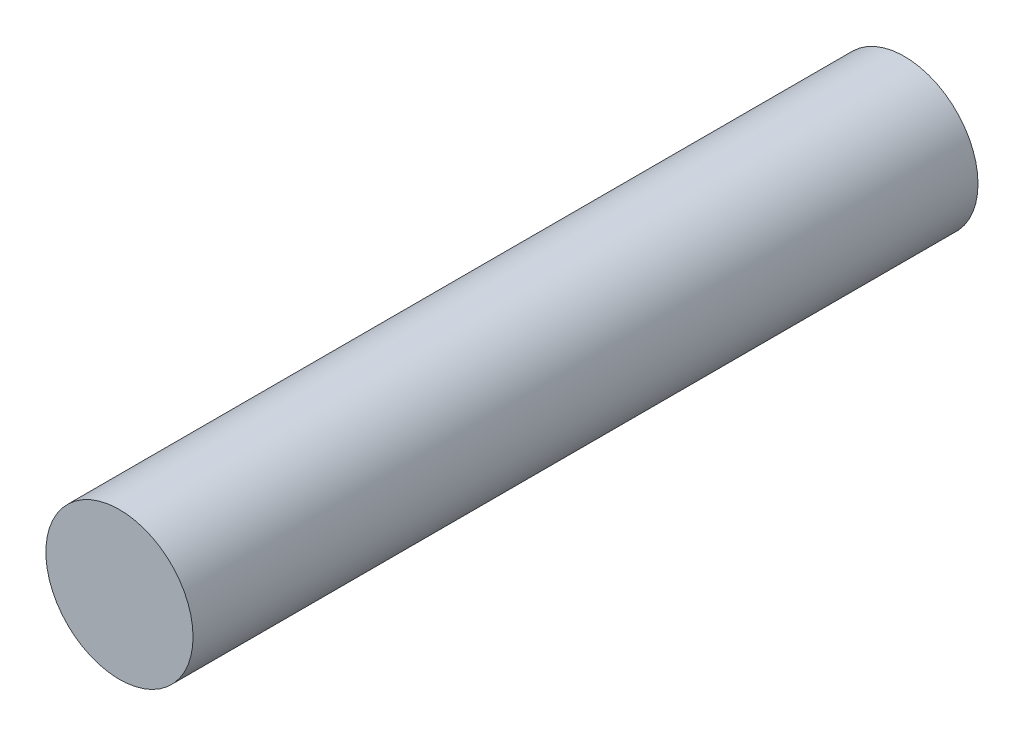
ISO-10303-21;
HEADER;
FILE_DESCRIPTION(('STEP AP214'),'2;1');
FILE_NAME('part.step','',(''),(''),'','','');
FILE_SCHEMA(('AUTOMOTIVE_DESIGN { 1 0 10303 214 1 1 1 1 }'));
ENDSEC;
DATA;
#1=APPLICATION_CONTEXT('core data for automotive mechanical design processes');
#2=APPLICATION_PROTOCOL_DEFINITION('international standard','automotive_design',2000,#1);
#3=PRODUCT_CONTEXT('',#1,'mechanical');
#4=PRODUCT('Part','Part','',(#3));
#5=PRODUCT_RELATED_PRODUCT_CATEGORY('part','',(#4));
#6=PRODUCT_DEFINITION_FORMATION('','',#4);
#7=PRODUCT_DEFINITION_CONTEXT('part definition',#1,'design');
#8=PRODUCT_DEFINITION('design','',#6,#7);
#9=PRODUCT_DEFINITION_SHAPE('','',#8);
#10=(LENGTH_UNIT() NAMED_UNIT(*) SI_UNIT(.MILLI.,.METRE.));
#11=(NAMED_UNIT(*) PLANE_ANGLE_UNIT() SI_UNIT($,.RADIAN.));
#12=(NAMED_UNIT(*) SI_UNIT($,.STERADIAN.) SOLID_ANGLE_UNIT());
#13=UNCERTAINTY_MEASURE_WITH_UNIT(LENGTH_MEASURE(1.E-05),#10,'distance_accuracy_value','');
#14=(GEOMETRIC_REPRESENTATION_CONTEXT(3) GLOBAL_UNCERTAINTY_ASSIGNED_CONTEXT((#13)) GLOBAL_UNIT_ASSIGNED_CONTEXT((#10,
#11,#12)) REPRESENTATION_CONTEXT('',''));
#15=CARTESIAN_POINT('',(0.,0.,0.));
#16=DIRECTION('',(0.,0.,1.));
#17=DIRECTION('',(1.,0.,0.));
#18=AXIS2_PLACEMENT_3D('',#15,#16,#17);
#19=CARTESIAN_POINT('',(0.,0.,25.4));
#20=DIRECTION('',(0.,0.,-1.));
#21=DIRECTION('',(-1.,0.,0.));
#22=AXIS2_PLACEMENT_3D('',#19,#20,#21);
#23=CYLINDRICAL_SURFACE('',#22,4.7625);
#24=CARTESIAN_POINT('',(0.,0.,25.4));
#25=DIRECTION('',(0.,0.,1.));
#26=DIRECTION('',(1.,0.,0.));
#27=AXIS2_PLACEMENT_3D('',#24,#25,#26);
#28=CIRCLE('',#27,4.7625);
#29=CARTESIAN_POINT('',(4.7625,0.,25.4));
#30=VERTEX_POINT('',#29);
#31=EDGE_CURVE('E10',#30,#30,#28,.T.);
#32=ORIENTED_EDGE('',*,*,#31,.F.);
#33=EDGE_LOOP('',(#32));
#34=FACE_BOUND('',#33,.T.);
#35=CARTESIAN_POINT('',(0.,0.,-25.4));
#36=DIRECTION('',(0.,0.,1.));
#37=DIRECTION('',(1.,0.,0.));
#38=AXIS2_PLACEMENT_3D('',#35,#36,#37);
#39=CIRCLE('',#38,4.7625);
#40=CARTESIAN_POINT('',(4.7625,0.,-25.4));
#41=VERTEX_POINT('',#40);
#42=EDGE_CURVE('E42',#41,#41,#39,.T.);
#43=ORIENTED_EDGE('',*,*,#42,.T.);
#44=EDGE_LOOP('',(#43));
#45=FACE_BOUND('',#44,.T.);
#46=ADVANCED_FACE('F39',(#34,#45),#23,.T.);
#47=CARTESIAN_POINT('',(0.,0.,25.4));
#48=DIRECTION('',(0.,0.,1.));
#49=DIRECTION('',(1.,0.,0.));
#50=AXIS2_PLACEMENT_3D('',#47,#48,#49);
#51=PLANE('',#50);
#52=ORIENTED_EDGE('',*,*,#31,.T.);
#53=EDGE_LOOP('',(#52));
#54=FACE_BOUND('',#53,.T.);
#55=ADVANCED_FACE('F56',(#54),#51,.T.);
#56=CARTESIAN_POINT('',(0.,0.,-25.4));
#57=DIRECTION('',(0.,0.,1.));
#58=DIRECTION('',(1.,0.,0.));
#59=AXIS2_PLACEMENT_3D('',#56,#57,#58);
#60=PLANE('',#59);
#61=ORIENTED_EDGE('',*,*,#42,.F.);
#62=EDGE_LOOP('',(#61));
#63=FACE_BOUND('',#62,.T.);
#64=ADVANCED_FACE('F54',(#63),#60,.F.);
#65=CLOSED_SHELL('',(#46,#55,#64));
#66=MANIFOLD_SOLID_BREP('B2',#65);
#67=ADVANCED_BREP_SHAPE_REPRESENTATION('',(#18,#66),#14);
#68=SHAPE_DEFINITION_REPRESENTATION(#9,#67);
ENDSEC;
END-ISO-10303-21;
